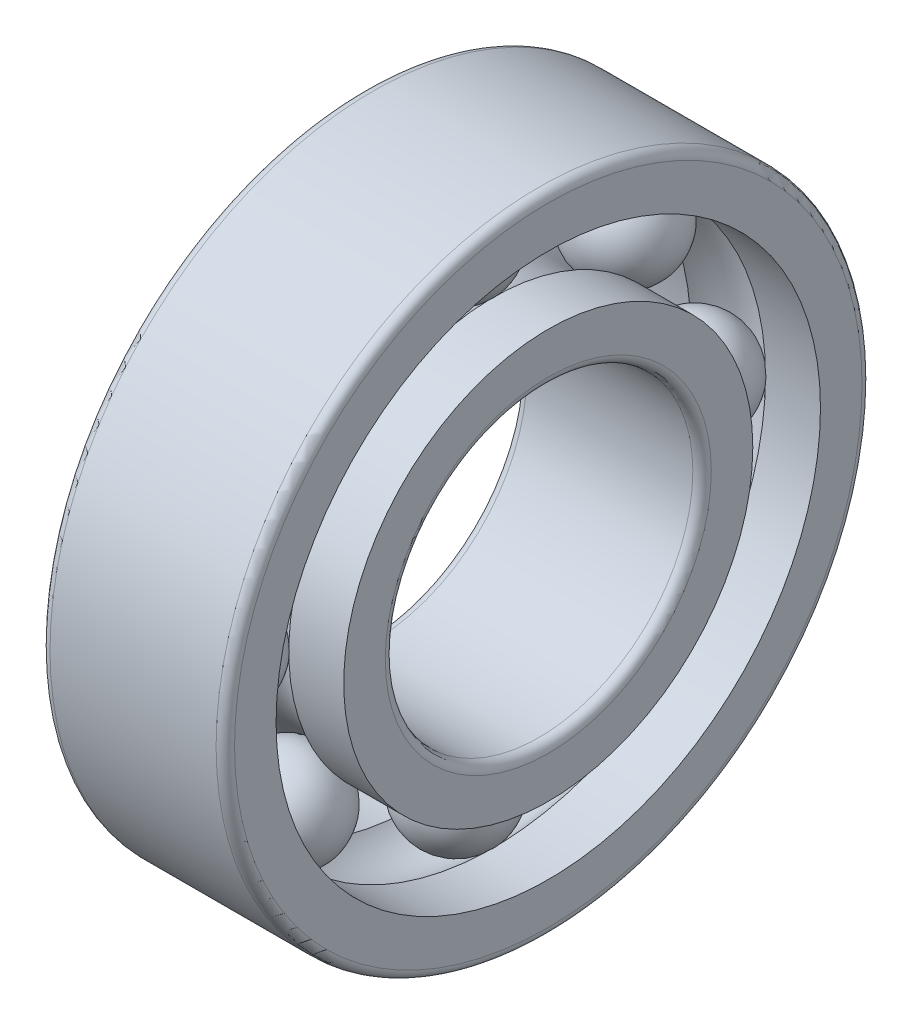
ISO-10303-21;
HEADER;
FILE_DESCRIPTION(('STEP AP214'),'2;1');
FILE_NAME('part.step','',(''),(''),'','','');
FILE_SCHEMA(('AUTOMOTIVE_DESIGN { 1 0 10303 214 1 1 1 1 }'));
ENDSEC;
DATA;
#1=APPLICATION_CONTEXT('core data for automotive mechanical design processes');
#2=APPLICATION_PROTOCOL_DEFINITION('international standard','automotive_design',2000,#1);
#3=PRODUCT_CONTEXT('',#1,'mechanical');
#4=PRODUCT('Part','Part','',(#3));
#5=PRODUCT_RELATED_PRODUCT_CATEGORY('part','',(#4));
#6=PRODUCT_DEFINITION_FORMATION('','',#4);
#7=PRODUCT_DEFINITION_CONTEXT('part definition',#1,'design');
#8=PRODUCT_DEFINITION('design','',#6,#7);
#9=PRODUCT_DEFINITION_SHAPE('','',#8);
#10=(LENGTH_UNIT() NAMED_UNIT(*) SI_UNIT(.MILLI.,.METRE.));
#11=(NAMED_UNIT(*) PLANE_ANGLE_UNIT() SI_UNIT($,.RADIAN.));
#12=(NAMED_UNIT(*) SI_UNIT($,.STERADIAN.) SOLID_ANGLE_UNIT());
#13=UNCERTAINTY_MEASURE_WITH_UNIT(LENGTH_MEASURE(1.E-05),#10,'distance_accuracy_value','');
#14=(GEOMETRIC_REPRESENTATION_CONTEXT(3) GLOBAL_UNCERTAINTY_ASSIGNED_CONTEXT((#13)) GLOBAL_UNIT_ASSIGNED_CONTEXT((#10,
#11,#12)) REPRESENTATION_CONTEXT('',''));
#15=CARTESIAN_POINT('',(0.,0.,0.));
#16=DIRECTION('',(0.,0.,1.));
#17=DIRECTION('',(1.,0.,0.));
#18=AXIS2_PLACEMENT_3D('',#15,#16,#17);
#19=CARTESIAN_POINT('',(0.,10.9601551083916,10.9601551083914));
#20=DIRECTION('',(1.,0.,0.));
#21=DIRECTION('',(0.,-0.707106781186557,-0.70710678118654));
#22=AXIS2_PLACEMENT_3D('',#19,#20,#21);
#23=SPHERICAL_SURFACE('',#22,3.3);
#24=CARTESIAN_POINT('',(3.3,10.9601551083916,10.9601551083914));
#25=VERTEX_POINT('',#24);
#26=VERTEX_LOOP('',#25);
#27=FACE_BOUND('',#26,.T.);
#28=ADVANCED_FACE('F39',(#27),#23,.T.);
#29=CLOSED_SHELL('',(#28));
#30=MANIFOLD_SOLID_BREP('B2',#29);
#31=CARTESIAN_POINT('',(0.,1.71737624121704E-13,15.5));
#32=DIRECTION('',(1.,0.,0.));
#33=DIRECTION('',(0.,0.,-1.));
#34=AXIS2_PLACEMENT_3D('',#31,#32,#33);
#35=SPHERICAL_SURFACE('',#34,3.3);
#36=CARTESIAN_POINT('',(3.3,1.71737624121704E-13,15.5));
#37=VERTEX_POINT('',#36);
#38=VERTEX_LOOP('',#37);
#39=FACE_BOUND('',#38,.T.);
#40=ADVANCED_FACE('F57',(#39),#35,.T.);
#41=CLOSED_SHELL('',(#40));
#42=MANIFOLD_SOLID_BREP('B6',#41);
#43=CARTESIAN_POINT('',(0.,-10.9601551083914,10.9601551083916));
#44=DIRECTION('',(1.,0.,0.));
#45=DIRECTION('',(0.,0.707106781186541,-0.707106781186553));
#46=AXIS2_PLACEMENT_3D('',#43,#44,#45);
#47=SPHERICAL_SURFACE('',#46,3.3);
#48=CARTESIAN_POINT('',(3.3,-10.9601551083914,10.9601551083916));
#49=VERTEX_POINT('',#48);
#50=VERTEX_LOOP('',#49);
#51=FACE_BOUND('',#50,.T.);
#52=ADVANCED_FACE('F75',(#51),#47,.T.);
#53=CLOSED_SHELL('',(#52));
#54=MANIFOLD_SOLID_BREP('B35',#53);
#55=CARTESIAN_POINT('',(0.,-15.5,0.));
#56=DIRECTION('',(1.,0.,0.));
#57=DIRECTION('',(0.,1.,0.));
#58=AXIS2_PLACEMENT_3D('',#55,#56,#57);
#59=SPHERICAL_SURFACE('',#58,3.3);
#60=CARTESIAN_POINT('',(3.3,-15.5,0.));
#61=VERTEX_POINT('',#60);
#62=VERTEX_LOOP('',#61);
#63=FACE_BOUND('',#62,.T.);
#64=ADVANCED_FACE('F93',(#63),#59,.T.);
#65=CLOSED_SHELL('',(#64));
#66=MANIFOLD_SOLID_BREP('B53',#65);
#67=CARTESIAN_POINT('',(0.,-10.9601551083916,-10.9601551083914));
#68=DIRECTION('',(1.,0.,0.));
#69=DIRECTION('',(0.,0.707106781186552,0.707106781186545));
#70=AXIS2_PLACEMENT_3D('',#67,#68,#69);
#71=SPHERICAL_SURFACE('',#70,3.3);
#72=CARTESIAN_POINT('',(3.3,-10.9601551083916,-10.9601551083914));
#73=VERTEX_POINT('',#72);
#74=VERTEX_LOOP('',#73);
#75=FACE_BOUND('',#74,.T.);
#76=ADVANCED_FACE('F111',(#75),#71,.T.);
#77=CLOSED_SHELL('',(#76));
#78=MANIFOLD_SOLID_BREP('B71',#77);
#79=CARTESIAN_POINT('',(0.,0.,-15.5));
#80=DIRECTION('',(1.,0.,0.));
#81=DIRECTION('',(0.,0.,1.));
#82=AXIS2_PLACEMENT_3D('',#79,#80,#81);
#83=SPHERICAL_SURFACE('',#82,3.3);
#84=CARTESIAN_POINT('',(3.3,0.,-15.5));
#85=VERTEX_POINT('',#84);
#86=VERTEX_LOOP('',#85);
#87=FACE_BOUND('',#86,.T.);
#88=ADVANCED_FACE('F129',(#87),#83,.T.);
#89=CLOSED_SHELL('',(#88));
#90=MANIFOLD_SOLID_BREP('B89',#89);
#91=CARTESIAN_POINT('',(0.,10.9601551083915,-10.9601551083915));
#92=DIRECTION('',(1.,0.,0.));
#93=DIRECTION('',(0.,-0.707106781186546,0.707106781186549));
#94=AXIS2_PLACEMENT_3D('',#91,#92,#93);
#95=SPHERICAL_SURFACE('',#94,3.3);
#96=CARTESIAN_POINT('',(3.3,10.9601551083915,-10.9601551083915));
#97=VERTEX_POINT('',#96);
#98=VERTEX_LOOP('',#97);
#99=FACE_BOUND('',#98,.T.);
#100=ADVANCED_FACE('F149',(#99),#95,.T.);
#101=CLOSED_SHELL('',(#100));
#102=MANIFOLD_SOLID_BREP('B107',#101);
#103=CARTESIAN_POINT('',(-20.6375,0.,0.));
#104=DIRECTION('',(1.,0.,0.));
#105=DIRECTION('',(0.,0.,-1.));
#106=AXIS2_PLACEMENT_3D('',#103,#104,#105);
#107=CYLINDRICAL_SURFACE('',#106,13.3);
#108=CARTESIAN_POINT('',(-5.88803079074583,0.,0.));
#109=DIRECTION('',(-1.,0.,0.));
#110=DIRECTION('',(0.,0.,1.));
#111=AXIS2_PLACEMENT_3D('',#108,#109,#110);
#112=CIRCLE('',#111,13.3);
#113=CARTESIAN_POINT('',(-5.88803079074583,0.,13.3));
#114=VERTEX_POINT('',#113);
#115=EDGE_CURVE('E178',#114,#114,#112,.F.);
#116=ORIENTED_EDGE('',*,*,#115,.F.);
#117=EDGE_LOOP('',(#116));
#118=FACE_BOUND('',#117,.T.);
#119=CARTESIAN_POINT('',(-6.,0.,0.));
#120=DIRECTION('',(1.,0.,0.));
#121=DIRECTION('',(0.,0.,-1.));
#122=AXIS2_PLACEMENT_3D('',#119,#120,#121);
#123=CIRCLE('',#122,13.3);
#124=CARTESIAN_POINT('',(-6.,0.,-13.3));
#125=VERTEX_POINT('',#124);
#126=EDGE_CURVE('E186',#125,#125,#123,.T.);
#127=ORIENTED_EDGE('',*,*,#126,.T.);
#128=EDGE_LOOP('',(#127));
#129=FACE_BOUND('',#128,.T.);
#130=ADVANCED_FACE('F166',(#118,#129),#107,.T.);
#131=CARTESIAN_POINT('',(0.,0.,0.));
#132=DIRECTION('',(1.,0.,0.));
#133=DIRECTION('',(0.,0.,-1.));
#134=AXIS2_PLACEMENT_3D('',#131,#132,#133);
#135=TOROIDAL_SURFACE('',#134,15.5,3.275);
#136=CARTESIAN_POINT('',(-2.42603070879163,0.,0.));
#137=DIRECTION('',(1.,0.,0.));
#138=DIRECTION('',(0.,0.,-1.));
#139=AXIS2_PLACEMENT_3D('',#136,#137,#138);
#140=CIRCLE('',#139,13.3);
#141=CARTESIAN_POINT('',(-2.42603070879163,0.,-13.3));
#142=VERTEX_POINT('',#141);
#143=EDGE_CURVE('E183',#142,#142,#140,.T.);
#144=ORIENTED_EDGE('',*,*,#143,.T.);
#145=EDGE_LOOP('',(#144));
#146=FACE_BOUND('',#145,.T.);
#147=CARTESIAN_POINT('',(2.42603070879163,0.,0.));
#148=DIRECTION('',(1.,0.,0.));
#149=DIRECTION('',(0.,0.,-1.));
#150=AXIS2_PLACEMENT_3D('',#147,#148,#149);
#151=CIRCLE('',#150,13.3);
#152=CARTESIAN_POINT('',(2.42603070879163,0.,-13.3));
#153=VERTEX_POINT('',#152);
#154=EDGE_CURVE('E204',#153,#153,#151,.T.);
#155=ORIENTED_EDGE('',*,*,#154,.F.);
#156=EDGE_LOOP('',(#155));
#157=FACE_BOUND('',#156,.T.);
#158=ADVANCED_FACE('F168',(#146,#157),#135,.F.);
#159=CARTESIAN_POINT('',(-20.6375,0.,0.));
#160=DIRECTION('',(1.,0.,0.));
#161=DIRECTION('',(0.,0.,-1.));
#162=AXIS2_PLACEMENT_3D('',#159,#160,#161);
#163=CYLINDRICAL_SURFACE('',#162,13.3);
#164=ORIENTED_EDGE('',*,*,#154,.T.);
#165=EDGE_LOOP('',(#164));
#166=FACE_BOUND('',#165,.T.);
#167=CARTESIAN_POINT('',(6.,0.,0.));
#168=DIRECTION('',(1.,0.,0.));
#169=DIRECTION('',(0.,0.,-1.));
#170=AXIS2_PLACEMENT_3D('',#167,#168,#169);
#171=CIRCLE('',#170,13.3);
#172=CARTESIAN_POINT('',(6.,0.,-13.3));
#173=VERTEX_POINT('',#172);
#174=EDGE_CURVE('E201',#173,#173,#171,.T.);
#175=ORIENTED_EDGE('',*,*,#174,.F.);
#176=EDGE_LOOP('',(#175));
#177=FACE_BOUND('',#176,.T.);
#178=ADVANCED_FACE('F244',(#166,#177),#163,.T.);
#179=CARTESIAN_POINT('',(6.,10.6,0.));
#180=DIRECTION('',(1.,0.,0.));
#181=DIRECTION('',(0.,0.,-1.));
#182=AXIS2_PLACEMENT_3D('',#179,#180,#181);
#183=PLANE('',#182);
#184=ORIENTED_EDGE('',*,*,#174,.T.);
#185=EDGE_LOOP('',(#184));
#186=FACE_BOUND('',#185,.T.);
#187=CARTESIAN_POINT('',(6.,0.,0.));
#188=DIRECTION('',(1.,0.,0.));
#189=DIRECTION('',(0.,0.,-1.));
#190=AXIS2_PLACEMENT_3D('',#187,#188,#189);
#191=CIRCLE('',#190,10.6);
#192=CARTESIAN_POINT('',(6.,0.,-10.6));
#193=VERTEX_POINT('',#192);
#194=EDGE_CURVE('E198',#193,#193,#191,.T.);
#195=ORIENTED_EDGE('',*,*,#194,.F.);
#196=EDGE_LOOP('',(#195));
#197=FACE_BOUND('',#196,.T.);
#198=ADVANCED_FACE('F241',(#186,#197),#183,.T.);
#199=CARTESIAN_POINT('',(5.4,0.,0.));
#200=DIRECTION('',(1.,0.,0.));
#201=DIRECTION('',(0.,0.,-1.));
#202=AXIS2_PLACEMENT_3D('',#199,#200,#201);
#203=TOROIDAL_SURFACE('',#202,10.6,0.600000000000002);
#204=ORIENTED_EDGE('',*,*,#194,.T.);
#205=EDGE_LOOP('',(#204));
#206=FACE_BOUND('',#205,.T.);
#207=CARTESIAN_POINT('',(5.4,0.,0.));
#208=DIRECTION('',(1.,0.,0.));
#209=DIRECTION('',(0.,0.,-1.));
#210=AXIS2_PLACEMENT_3D('',#207,#208,#209);
#211=CIRCLE('',#210,9.99999999999999);
#212=CARTESIAN_POINT('',(5.4,0.,-10.));
#213=VERTEX_POINT('',#212);
#214=EDGE_CURVE('E195',#213,#213,#211,.T.);
#215=ORIENTED_EDGE('',*,*,#214,.F.);
#216=EDGE_LOOP('',(#215));
#217=FACE_BOUND('',#216,.T.);
#218=ADVANCED_FACE('F237',(#206,#217),#203,.T.);
#219=CARTESIAN_POINT('',(-20.6375,0.,0.));
#220=DIRECTION('',(1.,0.,0.));
#221=DIRECTION('',(0.,0.,-1.));
#222=AXIS2_PLACEMENT_3D('',#219,#220,#221);
#223=CYLINDRICAL_SURFACE('',#222,9.99999999999999);
#224=ORIENTED_EDGE('',*,*,#214,.T.);
#225=EDGE_LOOP('',(#224));
#226=FACE_BOUND('',#225,.T.);
#227=CARTESIAN_POINT('',(-5.4,0.,0.));
#228=DIRECTION('',(1.,0.,0.));
#229=DIRECTION('',(0.,0.,-1.));
#230=AXIS2_PLACEMENT_3D('',#227,#228,#229);
#231=CIRCLE('',#230,10.);
#232=CARTESIAN_POINT('',(-5.4,0.,-10.));
#233=VERTEX_POINT('',#232);
#234=EDGE_CURVE('E192',#233,#233,#231,.T.);
#235=ORIENTED_EDGE('',*,*,#234,.F.);
#236=EDGE_LOOP('',(#235));
#237=FACE_BOUND('',#236,.T.);
#238=ADVANCED_FACE('F230',(#226,#237),#223,.F.);
#239=CARTESIAN_POINT('',(-5.4,0.,0.));
#240=DIRECTION('',(1.,0.,0.));
#241=DIRECTION('',(0.,0.,-1.));
#242=AXIS2_PLACEMENT_3D('',#239,#240,#241);
#243=TOROIDAL_SURFACE('',#242,10.6,0.600000000000002);
#244=ORIENTED_EDGE('',*,*,#234,.T.);
#245=EDGE_LOOP('',(#244));
#246=FACE_BOUND('',#245,.T.);
#247=CARTESIAN_POINT('',(-6.,0.,0.));
#248=DIRECTION('',(1.,0.,0.));
#249=DIRECTION('',(0.,0.,-1.));
#250=AXIS2_PLACEMENT_3D('',#247,#248,#249);
#251=CIRCLE('',#250,10.6);
#252=CARTESIAN_POINT('',(-6.,0.,-10.6));
#253=VERTEX_POINT('',#252);
#254=EDGE_CURVE('E189',#253,#253,#251,.T.);
#255=ORIENTED_EDGE('',*,*,#254,.F.);
#256=EDGE_LOOP('',(#255));
#257=FACE_BOUND('',#256,.T.);
#258=ADVANCED_FACE('F222',(#246,#257),#243,.T.);
#259=CARTESIAN_POINT('',(-6.,13.3,0.));
#260=DIRECTION('',(-1.,0.,0.));
#261=DIRECTION('',(0.,0.,1.));
#262=AXIS2_PLACEMENT_3D('',#259,#260,#261);
#263=PLANE('',#262);
#264=ORIENTED_EDGE('',*,*,#254,.T.);
#265=EDGE_LOOP('',(#264));
#266=FACE_BOUND('',#265,.T.);
#267=ORIENTED_EDGE('',*,*,#126,.F.);
#268=EDGE_LOOP('',(#267));
#269=FACE_BOUND('',#268,.T.);
#270=ADVANCED_FACE('F220',(#266,#269),#263,.T.);
#271=CARTESIAN_POINT('',(-5.68803079074584,0.,0.));
#272=DIRECTION('',(1.,0.,0.));
#273=DIRECTION('',(0.,0.,-1.));
#274=AXIS2_PLACEMENT_3D('',#271,#272,#273);
#275=CIRCLE('',#274,13.3);
#276=CARTESIAN_POINT('',(-5.68803079074584,0.,-13.3));
#277=VERTEX_POINT('',#276);
#278=EDGE_CURVE('E207',#277,#277,#275,.F.);
#279=ORIENTED_EDGE('',*,*,#278,.F.);
#280=EDGE_LOOP('',(#279));
#281=FACE_BOUND('',#280,.T.);
#282=ORIENTED_EDGE('',*,*,#143,.F.);
#283=EDGE_LOOP('',(#282));
#284=FACE_BOUND('',#283,.T.);
#285=ADVANCED_FACE('F217',(#281,#284),#107,.T.);
#286=CARTESIAN_POINT('',(-5.88803079074583,17.7798440104669,0.));
#287=DIRECTION('',(-1.,0.,0.));
#288=DIRECTION('',(0.,0.,1.));
#289=AXIS2_PLACEMENT_3D('',#286,#287,#288);
#290=PLANE('',#289);
#291=CARTESIAN_POINT('',(-5.88803079074583,0.,0.));
#292=DIRECTION('',(-1.,0.,0.));
#293=DIRECTION('',(0.,0.,1.));
#294=AXIS2_PLACEMENT_3D('',#291,#292,#293);
#295=CIRCLE('',#294,17.7);
#296=CARTESIAN_POINT('',(-5.88803079074583,0.,17.7));
#297=VERTEX_POINT('',#296);
#298=EDGE_CURVE('E148',#297,#297,#295,.F.);
#299=ORIENTED_EDGE('',*,*,#298,.F.);
#300=EDGE_LOOP('',(#299));
#301=FACE_BOUND('',#300,.T.);
#302=ORIENTED_EDGE('',*,*,#115,.T.);
#303=EDGE_LOOP('',(#302));
#304=FACE_BOUND('',#303,.T.);
#305=ADVANCED_FACE('F212',(#301,#304),#290,.T.);
#306=CARTESIAN_POINT('',(-5.68803079074584,17.7798440104669,0.));
#307=DIRECTION('',(1.,0.,0.));
#308=DIRECTION('',(0.,0.,-1.));
#309=AXIS2_PLACEMENT_3D('',#306,#307,#308);
#310=PLANE('',#309);
#311=CARTESIAN_POINT('',(-5.68803079074584,0.,0.));
#312=DIRECTION('',(1.,0.,0.));
#313=DIRECTION('',(0.,0.,-1.));
#314=AXIS2_PLACEMENT_3D('',#311,#312,#313);
#315=CIRCLE('',#314,17.7);
#316=CARTESIAN_POINT('',(-5.68803079074584,0.,-17.7));
#317=VERTEX_POINT('',#316);
#318=EDGE_CURVE('E170',#317,#317,#315,.F.);
#319=ORIENTED_EDGE('',*,*,#318,.F.);
#320=EDGE_LOOP('',(#319));
#321=FACE_BOUND('',#320,.T.);
#322=ORIENTED_EDGE('',*,*,#278,.T.);
#323=EDGE_LOOP('',(#322));
#324=FACE_BOUND('',#323,.T.);
#325=ADVANCED_FACE('F289',(#321,#324),#310,.T.);
#326=CARTESIAN_POINT('',(-20.6375,0.,0.));
#327=DIRECTION('',(1.,0.,0.));
#328=DIRECTION('',(0.,0.,-1.));
#329=AXIS2_PLACEMENT_3D('',#326,#327,#328);
#330=CYLINDRICAL_SURFACE('',#329,17.7);
#331=ORIENTED_EDGE('',*,*,#298,.T.);
#332=EDGE_LOOP('',(#331));
#333=FACE_BOUND('',#332,.T.);
#334=CARTESIAN_POINT('',(-6.,0.,0.));
#335=DIRECTION('',(1.,0.,0.));
#336=DIRECTION('',(0.,0.,-1.));
#337=AXIS2_PLACEMENT_3D('',#334,#335,#336);
#338=CIRCLE('',#337,17.7);
#339=CARTESIAN_POINT('',(-6.,0.,-17.7));
#340=VERTEX_POINT('',#339);
#341=EDGE_CURVE('E430',#340,#340,#338,.T.);
#342=ORIENTED_EDGE('',*,*,#341,.F.);
#343=EDGE_LOOP('',(#342));
#344=FACE_BOUND('',#343,.T.);
#345=ADVANCED_FACE('F282',(#333,#344),#330,.F.);
#346=CARTESIAN_POINT('',(0.,0.,0.));
#347=DIRECTION('',(1.,0.,0.));
#348=DIRECTION('',(0.,0.,-1.));
#349=AXIS2_PLACEMENT_3D('',#346,#347,#348);
#350=TOROIDAL_SURFACE('',#349,15.5,3.275);
#351=CARTESIAN_POINT('',(2.42603070879163,0.,0.));
#352=DIRECTION('',(1.,0.,0.));
#353=DIRECTION('',(0.,0.,-1.));
#354=AXIS2_PLACEMENT_3D('',#351,#352,#353);
#355=CIRCLE('',#354,17.7);
#356=CARTESIAN_POINT('',(2.42603070879163,0.,-17.7));
#357=VERTEX_POINT('',#356);
#358=EDGE_CURVE('E181',#357,#357,#355,.T.);
#359=ORIENTED_EDGE('',*,*,#358,.T.);
#360=EDGE_LOOP('',(#359));
#361=FACE_BOUND('',#360,.T.);
#362=CARTESIAN_POINT('',(-2.42603070879163,0.,0.));
#363=DIRECTION('',(1.,0.,0.));
#364=DIRECTION('',(0.,0.,-1.));
#365=AXIS2_PLACEMENT_3D('',#362,#363,#364);
#366=CIRCLE('',#365,17.7);
#367=CARTESIAN_POINT('',(-2.42603070879163,0.,-17.7));
#368=VERTEX_POINT('',#367);
#369=EDGE_CURVE('E428',#368,#368,#366,.T.);
#370=ORIENTED_EDGE('',*,*,#369,.F.);
#371=EDGE_LOOP('',(#370));
#372=FACE_BOUND('',#371,.T.);
#373=ADVANCED_FACE('F288',(#361,#372),#350,.F.);
#374=CARTESIAN_POINT('',(-20.6375,0.,0.));
#375=DIRECTION('',(1.,0.,0.));
#376=DIRECTION('',(0.,0.,-1.));
#377=AXIS2_PLACEMENT_3D('',#374,#375,#376);
#378=CYLINDRICAL_SURFACE('',#377,17.7);
#379=CARTESIAN_POINT('',(6.,0.,0.));
#380=DIRECTION('',(1.,0.,0.));
#381=DIRECTION('',(0.,0.,-1.));
#382=AXIS2_PLACEMENT_3D('',#379,#380,#381);
#383=CIRCLE('',#382,17.7);
#384=CARTESIAN_POINT('',(6.,0.,-17.7));
#385=VERTEX_POINT('',#384);
#386=EDGE_CURVE('E446',#385,#385,#383,.T.);
#387=ORIENTED_EDGE('',*,*,#386,.T.);
#388=EDGE_LOOP('',(#387));
#389=FACE_BOUND('',#388,.T.);
#390=ORIENTED_EDGE('',*,*,#358,.F.);
#391=EDGE_LOOP('',(#390));
#392=FACE_BOUND('',#391,.T.);
#393=ADVANCED_FACE('F299',(#389,#392),#378,.F.);
#394=CARTESIAN_POINT('',(6.,20.4,0.));
#395=DIRECTION('',(1.,0.,0.));
#396=DIRECTION('',(0.,0.,-1.));
#397=AXIS2_PLACEMENT_3D('',#394,#395,#396);
#398=PLANE('',#397);
#399=CARTESIAN_POINT('',(6.,0.,0.));
#400=DIRECTION('',(1.,0.,0.));
#401=DIRECTION('',(0.,0.,-1.));
#402=AXIS2_PLACEMENT_3D('',#399,#400,#401);
#403=CIRCLE('',#402,20.4);
#404=CARTESIAN_POINT('',(6.,0.,-20.4));
#405=VERTEX_POINT('',#404);
#406=EDGE_CURVE('E444',#405,#405,#403,.T.);
#407=ORIENTED_EDGE('',*,*,#406,.T.);
#408=EDGE_LOOP('',(#407));
#409=FACE_BOUND('',#408,.T.);
#410=ORIENTED_EDGE('',*,*,#386,.F.);
#411=EDGE_LOOP('',(#410));
#412=FACE_BOUND('',#411,.T.);
#413=ADVANCED_FACE('F308',(#409,#412),#398,.T.);
#414=CARTESIAN_POINT('',(5.4,0.,0.));
#415=DIRECTION('',(1.,0.,0.));
#416=DIRECTION('',(0.,0.,-1.));
#417=AXIS2_PLACEMENT_3D('',#414,#415,#416);
#418=TOROIDAL_SURFACE('',#417,20.4,0.599999999999998);
#419=CARTESIAN_POINT('',(5.4,0.,0.));
#420=DIRECTION('',(1.,0.,0.));
#421=DIRECTION('',(0.,0.,-1.));
#422=AXIS2_PLACEMENT_3D('',#419,#420,#421);
#423=CIRCLE('',#422,21.);
#424=CARTESIAN_POINT('',(5.4,0.,-21.));
#425=VERTEX_POINT('',#424);
#426=EDGE_CURVE('E441',#425,#425,#423,.T.);
#427=ORIENTED_EDGE('',*,*,#426,.T.);
#428=EDGE_LOOP('',(#427));
#429=FACE_BOUND('',#428,.T.);
#430=ORIENTED_EDGE('',*,*,#406,.F.);
#431=EDGE_LOOP('',(#430));
#432=FACE_BOUND('',#431,.T.);
#433=ADVANCED_FACE('F317',(#429,#432),#418,.T.);
#434=CARTESIAN_POINT('',(-20.6375,0.,0.));
#435=DIRECTION('',(1.,0.,0.));
#436=DIRECTION('',(0.,0.,-1.));
#437=AXIS2_PLACEMENT_3D('',#434,#435,#436);
#438=CYLINDRICAL_SURFACE('',#437,21.);
#439=CARTESIAN_POINT('',(-5.4,0.,0.));
#440=DIRECTION('',(1.,0.,0.));
#441=DIRECTION('',(0.,0.,-1.));
#442=AXIS2_PLACEMENT_3D('',#439,#440,#441);
#443=CIRCLE('',#442,21.);
#444=CARTESIAN_POINT('',(-5.4,0.,-21.));
#445=VERTEX_POINT('',#444);
#446=EDGE_CURVE('E438',#445,#445,#443,.T.);
#447=ORIENTED_EDGE('',*,*,#446,.T.);
#448=EDGE_LOOP('',(#447));
#449=FACE_BOUND('',#448,.T.);
#450=ORIENTED_EDGE('',*,*,#426,.F.);
#451=EDGE_LOOP('',(#450));
#452=FACE_BOUND('',#451,.T.);
#453=ADVANCED_FACE('F326',(#449,#452),#438,.T.);
#454=CARTESIAN_POINT('',(-5.4,0.,0.));
#455=DIRECTION('',(1.,0.,0.));
#456=DIRECTION('',(0.,0.,-1.));
#457=AXIS2_PLACEMENT_3D('',#454,#455,#456);
#458=TOROIDAL_SURFACE('',#457,20.4,0.599999999999998);
#459=CARTESIAN_POINT('',(-6.,0.,0.));
#460=DIRECTION('',(1.,0.,0.));
#461=DIRECTION('',(0.,0.,-1.));
#462=AXIS2_PLACEMENT_3D('',#459,#460,#461);
#463=CIRCLE('',#462,20.4);
#464=CARTESIAN_POINT('',(-6.,0.,-20.4));
#465=VERTEX_POINT('',#464);
#466=EDGE_CURVE('E433',#465,#465,#463,.T.);
#467=ORIENTED_EDGE('',*,*,#466,.T.);
#468=EDGE_LOOP('',(#467));
#469=FACE_BOUND('',#468,.T.);
#470=ORIENTED_EDGE('',*,*,#446,.F.);
#471=EDGE_LOOP('',(#470));
#472=FACE_BOUND('',#471,.T.);
#473=ADVANCED_FACE('F335',(#469,#472),#458,.T.);
#474=CARTESIAN_POINT('',(-6.,17.7,0.));
#475=DIRECTION('',(-1.,0.,0.));
#476=DIRECTION('',(0.,0.,1.));
#477=AXIS2_PLACEMENT_3D('',#474,#475,#476);
#478=PLANE('',#477);
#479=ORIENTED_EDGE('',*,*,#341,.T.);
#480=EDGE_LOOP('',(#479));
#481=FACE_BOUND('',#480,.T.);
#482=ORIENTED_EDGE('',*,*,#466,.F.);
#483=EDGE_LOOP('',(#482));
#484=FACE_BOUND('',#483,.T.);
#485=ADVANCED_FACE('F344',(#481,#484),#478,.T.);
#486=ORIENTED_EDGE('',*,*,#318,.T.);
#487=EDGE_LOOP('',(#486));
#488=FACE_BOUND('',#487,.T.);
#489=ORIENTED_EDGE('',*,*,#369,.T.);
#490=EDGE_LOOP('',(#489));
#491=FACE_BOUND('',#490,.T.);
#492=ADVANCED_FACE('F291',(#488,#491),#330,.F.);
#493=CLOSED_SHELL('',(#130,#158,#178,#198,#218,#238,#258,#270,#285,#305,#325,#345,#373,#393,
#413,#433,#453,#473,#485,#492));
#494=MANIFOLD_SOLID_BREP('B125',#493);
#495=CARTESIAN_POINT('',(0.,15.5,0.));
#496=DIRECTION('',(1.,0.,0.));
#497=DIRECTION('',(0.,-1.,0.));
#498=AXIS2_PLACEMENT_3D('',#495,#496,#497);
#499=SPHERICAL_SURFACE('',#498,3.3);
#500=CARTESIAN_POINT('',(3.3,15.5,0.));
#501=VERTEX_POINT('',#500);
#502=VERTEX_LOOP('',#501);
#503=FACE_BOUND('',#502,.T.);
#504=ADVANCED_FACE('F465',(#503),#499,.T.);
#505=CLOSED_SHELL('',(#504));
#506=MANIFOLD_SOLID_BREP('B143',#505);
#507=ADVANCED_BREP_SHAPE_REPRESENTATION('',(#18,#30,#42,#54,#66,#78,#90,#102,#494,#506),#14);
#508=SHAPE_DEFINITION_REPRESENTATION(#9,#507);
ENDSEC;
END-ISO-10303-21;
